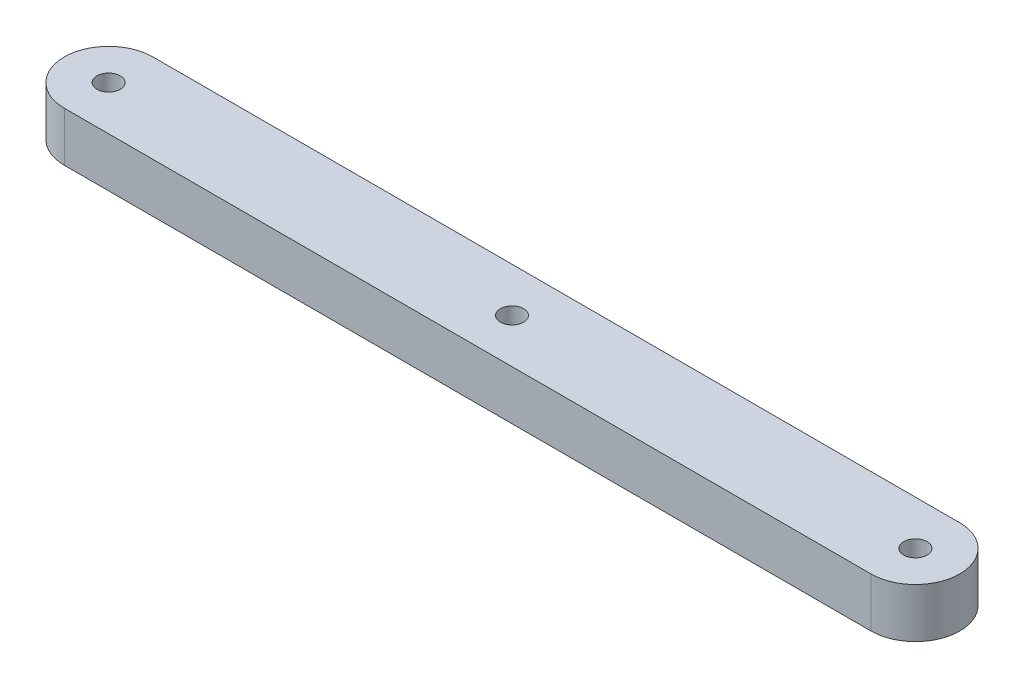
ISO-10303-21;
HEADER;
FILE_DESCRIPTION(('STEP AP214'),'2;1');
FILE_NAME('part.step','',(''),(''),'','','');
FILE_SCHEMA(('AUTOMOTIVE_DESIGN { 1 0 10303 214 1 1 1 1 }'));
ENDSEC;
DATA;
#1=APPLICATION_CONTEXT('core data for automotive mechanical design processes');
#2=APPLICATION_PROTOCOL_DEFINITION('international standard','automotive_design',2000,#1);
#3=PRODUCT_CONTEXT('',#1,'mechanical');
#4=PRODUCT('Part','Part','',(#3));
#5=PRODUCT_RELATED_PRODUCT_CATEGORY('part','',(#4));
#6=PRODUCT_DEFINITION_FORMATION('','',#4);
#7=PRODUCT_DEFINITION_CONTEXT('part definition',#1,'design');
#8=PRODUCT_DEFINITION('design','',#6,#7);
#9=PRODUCT_DEFINITION_SHAPE('','',#8);
#10=(LENGTH_UNIT() NAMED_UNIT(*) SI_UNIT(.MILLI.,.METRE.));
#11=(NAMED_UNIT(*) PLANE_ANGLE_UNIT() SI_UNIT($,.RADIAN.));
#12=(NAMED_UNIT(*) SI_UNIT($,.STERADIAN.) SOLID_ANGLE_UNIT());
#13=UNCERTAINTY_MEASURE_WITH_UNIT(LENGTH_MEASURE(1.E-05),#10,'distance_accuracy_value','');
#14=(GEOMETRIC_REPRESENTATION_CONTEXT(3) GLOBAL_UNCERTAINTY_ASSIGNED_CONTEXT((#13)) GLOBAL_UNIT_ASSIGNED_CONTEXT((#10,
#11,#12)) REPRESENTATION_CONTEXT('',''));
#15=CARTESIAN_POINT('',(0.,0.,0.));
#16=DIRECTION('',(0.,0.,1.));
#17=DIRECTION('',(1.,0.,0.));
#18=AXIS2_PLACEMENT_3D('',#15,#16,#17);
#19=CARTESIAN_POINT('',(0.,8.89,0.));
#20=DIRECTION('',(0.,1.,0.));
#21=DIRECTION('',(0.,0.,1.));
#22=AXIS2_PLACEMENT_3D('',#19,#20,#21);
#23=PLANE('',#22);
#24=CARTESIAN_POINT('',(72.52,8.89,0.));
#25=DIRECTION('',(0.,1.,0.));
#26=DIRECTION('',(0.,0.,1.));
#27=AXIS2_PLACEMENT_3D('',#24,#25,#26);
#28=CIRCLE('',#27,2.1);
#29=CARTESIAN_POINT('',(72.52,8.89,-2.1));
#30=VERTEX_POINT('',#29);
#31=EDGE_CURVE('E117',#30,#30,#28,.T.);
#32=ORIENTED_EDGE('',*,*,#31,.F.);
#33=EDGE_LOOP('',(#32));
#34=FACE_BOUND('',#33,.T.);
#35=CARTESIAN_POINT('',(0.,8.89,0.));
#36=DIRECTION('',(0.,1.,0.));
#37=DIRECTION('',(0.,0.,1.));
#38=AXIS2_PLACEMENT_3D('',#35,#36,#37);
#39=CIRCLE('',#38,7.97347609683682);
#40=CARTESIAN_POINT('',(0.,8.89,-7.97347609683682));
#41=VERTEX_POINT('',#40);
#42=CARTESIAN_POINT('',(0.,8.89,7.97347609683682));
#43=VERTEX_POINT('',#42);
#44=EDGE_CURVE('E87',#41,#43,#39,.T.);
#45=ORIENTED_EDGE('',*,*,#44,.T.);
#46=DIRECTION('',(1.,0.,0.));
#47=VECTOR('',#46,1.);
#48=CARTESIAN_POINT('',(0.,8.89,7.97347609683682));
#49=LINE('',#48,#47);
#50=CARTESIAN_POINT('',(145.04,8.89,7.97347609683682));
#51=VERTEX_POINT('',#50);
#52=EDGE_CURVE('E82',#43,#51,#49,.T.);
#53=ORIENTED_EDGE('',*,*,#52,.T.);
#54=CARTESIAN_POINT('',(145.04,8.89,0.));
#55=DIRECTION('',(0.,1.,0.));
#56=DIRECTION('',(0.,0.,1.));
#57=AXIS2_PLACEMENT_3D('',#54,#55,#56);
#58=CIRCLE('',#57,7.97347609683682);
#59=CARTESIAN_POINT('',(145.04,8.89,-7.97347609683682));
#60=VERTEX_POINT('',#59);
#61=EDGE_CURVE('E85',#51,#60,#58,.T.);
#62=ORIENTED_EDGE('',*,*,#61,.T.);
#63=DIRECTION('',(-1.,0.,0.));
#64=VECTOR('',#63,1.);
#65=CARTESIAN_POINT('',(0.,8.89,-7.97347609683682));
#66=LINE('',#65,#64);
#67=EDGE_CURVE('E52',#60,#41,#66,.T.);
#68=ORIENTED_EDGE('',*,*,#67,.T.);
#69=EDGE_LOOP('',(#45,#53,#62,#68));
#70=FACE_BOUND('',#69,.T.);
#71=CARTESIAN_POINT('',(145.04,8.89,0.));
#72=DIRECTION('',(0.,1.,0.));
#73=DIRECTION('',(0.,0.,1.));
#74=AXIS2_PLACEMENT_3D('',#71,#72,#73);
#75=CIRCLE('',#74,2.09999999999999);
#76=CARTESIAN_POINT('',(145.04,8.89,-2.09999999999999));
#77=VERTEX_POINT('',#76);
#78=EDGE_CURVE('E102',#77,#77,#75,.T.);
#79=ORIENTED_EDGE('',*,*,#78,.F.);
#80=EDGE_LOOP('',(#79));
#81=FACE_BOUND('',#80,.T.);
#82=CARTESIAN_POINT('',(0.,8.89,0.));
#83=DIRECTION('',(0.,1.,0.));
#84=DIRECTION('',(0.,0.,1.));
#85=AXIS2_PLACEMENT_3D('',#82,#83,#84);
#86=CIRCLE('',#85,2.1);
#87=CARTESIAN_POINT('',(0.,8.89,-2.1));
#88=VERTEX_POINT('',#87);
#89=EDGE_CURVE('E123',#88,#88,#86,.T.);
#90=ORIENTED_EDGE('',*,*,#89,.F.);
#91=EDGE_LOOP('',(#90));
#92=FACE_BOUND('',#91,.T.);
#93=ADVANCED_FACE('F35',(#34,#70,#81,#92),#23,.T.);
#94=CARTESIAN_POINT('',(0.,0.,0.));
#95=DIRECTION('',(0.,1.,0.));
#96=DIRECTION('',(0.,0.,1.));
#97=AXIS2_PLACEMENT_3D('',#94,#95,#96);
#98=PLANE('',#97);
#99=CARTESIAN_POINT('',(72.52,0.,0.));
#100=DIRECTION('',(0.,1.,0.));
#101=DIRECTION('',(0.,0.,1.));
#102=AXIS2_PLACEMENT_3D('',#99,#100,#101);
#103=CIRCLE('',#102,2.1);
#104=CARTESIAN_POINT('',(72.52,0.,-2.1));
#105=VERTEX_POINT('',#104);
#106=EDGE_CURVE('E120',#105,#105,#103,.T.);
#107=ORIENTED_EDGE('',*,*,#106,.T.);
#108=EDGE_LOOP('',(#107));
#109=FACE_BOUND('',#108,.T.);
#110=CARTESIAN_POINT('',(0.,0.,0.));
#111=DIRECTION('',(0.,1.,0.));
#112=DIRECTION('',(0.,0.,1.));
#113=AXIS2_PLACEMENT_3D('',#110,#111,#112);
#114=CIRCLE('',#113,7.97347609683682);
#115=CARTESIAN_POINT('',(0.,0.,-7.97347609683682));
#116=VERTEX_POINT('',#115);
#117=CARTESIAN_POINT('',(0.,0.,7.97347609683682));
#118=VERTEX_POINT('',#117);
#119=EDGE_CURVE('E99',#116,#118,#114,.T.);
#120=ORIENTED_EDGE('',*,*,#119,.F.);
#121=DIRECTION('',(-1.,0.,0.));
#122=VECTOR('',#121,1.);
#123=CARTESIAN_POINT('',(0.,0.,-7.97347609683682));
#124=LINE('',#123,#122);
#125=CARTESIAN_POINT('',(145.04,0.,-7.97347609683682));
#126=VERTEX_POINT('',#125);
#127=EDGE_CURVE('E75',#126,#116,#124,.T.);
#128=ORIENTED_EDGE('',*,*,#127,.F.);
#129=CARTESIAN_POINT('',(145.04,0.,0.));
#130=DIRECTION('',(0.,1.,0.));
#131=DIRECTION('',(0.,0.,1.));
#132=AXIS2_PLACEMENT_3D('',#129,#130,#131);
#133=CIRCLE('',#132,7.97347609683682);
#134=CARTESIAN_POINT('',(145.04,0.,7.97347609683682));
#135=VERTEX_POINT('',#134);
#136=EDGE_CURVE('E69',#135,#126,#133,.T.);
#137=ORIENTED_EDGE('',*,*,#136,.F.);
#138=DIRECTION('',(1.,0.,0.));
#139=VECTOR('',#138,1.);
#140=CARTESIAN_POINT('',(0.,0.,7.97347609683682));
#141=LINE('',#140,#139);
#142=EDGE_CURVE('E91',#118,#135,#141,.T.);
#143=ORIENTED_EDGE('',*,*,#142,.F.);
#144=EDGE_LOOP('',(#120,#128,#137,#143));
#145=FACE_BOUND('',#144,.T.);
#146=CARTESIAN_POINT('',(145.04,0.,0.));
#147=DIRECTION('',(0.,1.,0.));
#148=DIRECTION('',(0.,0.,1.));
#149=AXIS2_PLACEMENT_3D('',#146,#147,#148);
#150=CIRCLE('',#149,2.09999999999999);
#151=CARTESIAN_POINT('',(145.04,0.,-2.09999999999999));
#152=VERTEX_POINT('',#151);
#153=EDGE_CURVE('E114',#152,#152,#150,.T.);
#154=ORIENTED_EDGE('',*,*,#153,.T.);
#155=EDGE_LOOP('',(#154));
#156=FACE_BOUND('',#155,.T.);
#157=CARTESIAN_POINT('',(0.,0.,0.));
#158=DIRECTION('',(0.,1.,0.));
#159=DIRECTION('',(0.,0.,1.));
#160=AXIS2_PLACEMENT_3D('',#157,#158,#159);
#161=CIRCLE('',#160,2.1);
#162=CARTESIAN_POINT('',(0.,0.,-2.1));
#163=VERTEX_POINT('',#162);
#164=EDGE_CURVE('E126',#163,#163,#161,.T.);
#165=ORIENTED_EDGE('',*,*,#164,.T.);
#166=EDGE_LOOP('',(#165));
#167=FACE_BOUND('',#166,.T.);
#168=ADVANCED_FACE('F110',(#109,#145,#156,#167),#98,.F.);
#169=CARTESIAN_POINT('',(0.,8.89,0.));
#170=DIRECTION('',(0.,-1.,0.));
#171=DIRECTION('',(0.,0.,-1.));
#172=AXIS2_PLACEMENT_3D('',#169,#170,#171);
#173=CYLINDRICAL_SURFACE('',#172,7.97347609683682);
#174=ORIENTED_EDGE('',*,*,#119,.T.);
#175=DIRECTION('',(0.,-1.,0.));
#176=VECTOR('',#175,1.);
#177=CARTESIAN_POINT('',(0.,8.89,7.97347609683682));
#178=LINE('',#177,#176);
#179=EDGE_CURVE('E11',#43,#118,#178,.T.);
#180=ORIENTED_EDGE('',*,*,#179,.F.);
#181=ORIENTED_EDGE('',*,*,#44,.F.);
#182=DIRECTION('',(0.,-1.,0.));
#183=VECTOR('',#182,1.);
#184=CARTESIAN_POINT('',(0.,8.89,-7.97347609683682));
#185=LINE('',#184,#183);
#186=EDGE_CURVE('E95',#41,#116,#185,.T.);
#187=ORIENTED_EDGE('',*,*,#186,.T.);
#188=EDGE_LOOP('',(#174,#180,#181,#187));
#189=FACE_BOUND('',#188,.T.);
#190=ADVANCED_FACE('F37',(#189),#173,.T.);
#191=CARTESIAN_POINT('',(0.,8.89,7.97347609683682));
#192=DIRECTION('',(0.,0.,-1.));
#193=DIRECTION('',(-1.,0.,0.));
#194=AXIS2_PLACEMENT_3D('',#191,#192,#193);
#195=PLANE('',#194);
#196=ORIENTED_EDGE('',*,*,#142,.T.);
#197=DIRECTION('',(0.,-1.,0.));
#198=VECTOR('',#197,1.);
#199=CARTESIAN_POINT('',(145.04,8.89,7.97347609683682));
#200=LINE('',#199,#198);
#201=EDGE_CURVE('E44',#51,#135,#200,.T.);
#202=ORIENTED_EDGE('',*,*,#201,.F.);
#203=ORIENTED_EDGE('',*,*,#52,.F.);
#204=ORIENTED_EDGE('',*,*,#179,.T.);
#205=EDGE_LOOP('',(#196,#202,#203,#204));
#206=FACE_BOUND('',#205,.T.);
#207=ADVANCED_FACE('F90',(#206),#195,.F.);
#208=CARTESIAN_POINT('',(145.04,8.89,0.));
#209=DIRECTION('',(0.,-1.,0.));
#210=DIRECTION('',(0.,0.,-1.));
#211=AXIS2_PLACEMENT_3D('',#208,#209,#210);
#212=CYLINDRICAL_SURFACE('',#211,7.97347609683682);
#213=ORIENTED_EDGE('',*,*,#136,.T.);
#214=DIRECTION('',(0.,-1.,0.));
#215=VECTOR('',#214,1.);
#216=CARTESIAN_POINT('',(145.04,8.89,-7.97347609683682));
#217=LINE('',#216,#215);
#218=EDGE_CURVE('E92',#60,#126,#217,.T.);
#219=ORIENTED_EDGE('',*,*,#218,.F.);
#220=ORIENTED_EDGE('',*,*,#61,.F.);
#221=ORIENTED_EDGE('',*,*,#201,.T.);
#222=EDGE_LOOP('',(#213,#219,#220,#221));
#223=FACE_BOUND('',#222,.T.);
#224=ADVANCED_FACE('F93',(#223),#212,.T.);
#225=CARTESIAN_POINT('',(0.,8.89,-7.97347609683682));
#226=DIRECTION('',(0.,0.,1.));
#227=DIRECTION('',(1.,0.,0.));
#228=AXIS2_PLACEMENT_3D('',#225,#226,#227);
#229=PLANE('',#228);
#230=ORIENTED_EDGE('',*,*,#127,.T.);
#231=ORIENTED_EDGE('',*,*,#186,.F.);
#232=ORIENTED_EDGE('',*,*,#67,.F.);
#233=ORIENTED_EDGE('',*,*,#218,.T.);
#234=EDGE_LOOP('',(#230,#231,#232,#233));
#235=FACE_BOUND('',#234,.T.);
#236=ADVANCED_FACE('F107',(#235),#229,.F.);
#237=CARTESIAN_POINT('',(145.04,8.89,0.));
#238=DIRECTION('',(0.,-1.,0.));
#239=DIRECTION('',(0.,0.,-1.));
#240=AXIS2_PLACEMENT_3D('',#237,#238,#239);
#241=CYLINDRICAL_SURFACE('',#240,2.09999999999999);
#242=CARTESIAN_POINT('',(145.04,8.89,-2.09999999999999));
#243=CARTESIAN_POINT('',(145.04,8.79739583333333,-2.09999999999999));
#244=CARTESIAN_POINT('',(145.04,8.70479166666667,-2.09999999999999));
#245=CARTESIAN_POINT('',(145.04,8.51958333333333,-2.09999999999999));
#246=CARTESIAN_POINT('',(145.04,8.42697916666667,-2.09999999999999));
#247=CARTESIAN_POINT('',(145.04,8.24177083333333,-2.09999999999999));
#248=CARTESIAN_POINT('',(145.04,8.14916666666667,-2.09999999999999));
#249=CARTESIAN_POINT('',(145.04,7.96395833333333,-2.09999999999999));
#250=CARTESIAN_POINT('',(145.04,7.87135416666667,-2.09999999999999));
#251=CARTESIAN_POINT('',(145.04,7.68614583333333,-2.09999999999999));
#252=CARTESIAN_POINT('',(145.04,7.59354166666667,-2.09999999999999));
#253=CARTESIAN_POINT('',(145.04,7.40833333333333,-2.09999999999999));
#254=CARTESIAN_POINT('',(145.04,7.31572916666667,-2.09999999999999));
#255=CARTESIAN_POINT('',(145.04,7.13052083333333,-2.09999999999999));
#256=CARTESIAN_POINT('',(145.04,7.03791666666667,-2.09999999999999));
#257=CARTESIAN_POINT('',(145.04,6.85270833333333,-2.09999999999999));
#258=CARTESIAN_POINT('',(145.04,6.76010416666667,-2.09999999999999));
#259=CARTESIAN_POINT('',(145.04,6.57489583333333,-2.09999999999999));
#260=CARTESIAN_POINT('',(145.04,6.48229166666667,-2.09999999999999));
#261=CARTESIAN_POINT('',(145.04,6.29708333333333,-2.09999999999999));
#262=CARTESIAN_POINT('',(145.04,6.20447916666667,-2.09999999999999));
#263=CARTESIAN_POINT('',(145.04,6.01927083333333,-2.09999999999999));
#264=CARTESIAN_POINT('',(145.04,5.92666666666667,-2.09999999999999));
#265=CARTESIAN_POINT('',(145.04,5.74145833333333,-2.09999999999999));
#266=CARTESIAN_POINT('',(145.04,5.64885416666667,-2.09999999999999));
#267=CARTESIAN_POINT('',(145.04,5.46364583333333,-2.09999999999999));
#268=CARTESIAN_POINT('',(145.04,5.37104166666667,-2.09999999999999));
#269=CARTESIAN_POINT('',(145.04,5.18583333333333,-2.09999999999999));
#270=CARTESIAN_POINT('',(145.04,5.09322916666667,-2.09999999999999));
#271=CARTESIAN_POINT('',(145.04,4.90802083333333,-2.09999999999999));
#272=CARTESIAN_POINT('',(145.04,4.81541666666667,-2.09999999999999));
#273=CARTESIAN_POINT('',(145.04,4.63020833333333,-2.09999999999999));
#274=CARTESIAN_POINT('',(145.04,4.53760416666667,-2.09999999999999));
#275=CARTESIAN_POINT('',(145.04,4.35239583333333,-2.09999999999999));
#276=CARTESIAN_POINT('',(145.04,4.25979166666667,-2.09999999999999));
#277=CARTESIAN_POINT('',(145.04,4.07458333333333,-2.09999999999999));
#278=CARTESIAN_POINT('',(145.04,3.98197916666667,-2.09999999999999));
#279=CARTESIAN_POINT('',(145.04,3.79677083333333,-2.09999999999999));
#280=CARTESIAN_POINT('',(145.04,3.70416666666667,-2.09999999999999));
#281=CARTESIAN_POINT('',(145.04,3.51895833333333,-2.09999999999999));
#282=CARTESIAN_POINT('',(145.04,3.42635416666667,-2.09999999999999));
#283=CARTESIAN_POINT('',(145.04,3.24114583333333,-2.09999999999999));
#284=CARTESIAN_POINT('',(145.04,3.14854166666667,-2.09999999999999));
#285=CARTESIAN_POINT('',(145.04,2.96333333333333,-2.09999999999999));
#286=CARTESIAN_POINT('',(145.04,2.87072916666667,-2.09999999999999));
#287=CARTESIAN_POINT('',(145.04,2.68552083333333,-2.09999999999999));
#288=CARTESIAN_POINT('',(145.04,2.59291666666667,-2.09999999999999));
#289=CARTESIAN_POINT('',(145.04,2.40770833333333,-2.09999999999999));
#290=CARTESIAN_POINT('',(145.04,2.31510416666667,-2.09999999999999));
#291=CARTESIAN_POINT('',(145.04,2.12989583333333,-2.09999999999999));
#292=CARTESIAN_POINT('',(145.04,2.03729166666667,-2.09999999999999));
#293=CARTESIAN_POINT('',(145.04,1.85208333333333,-2.09999999999999));
#294=CARTESIAN_POINT('',(145.04,1.75947916666667,-2.09999999999999));
#295=CARTESIAN_POINT('',(145.04,1.57427083333333,-2.09999999999999));
#296=CARTESIAN_POINT('',(145.04,1.48166666666667,-2.09999999999999));
#297=CARTESIAN_POINT('',(145.04,1.29645833333333,-2.09999999999999));
#298=CARTESIAN_POINT('',(145.04,1.20385416666667,-2.09999999999999));
#299=CARTESIAN_POINT('',(145.04,1.01864583333333,-2.09999999999999));
#300=CARTESIAN_POINT('',(145.04,0.926041666666667,-2.09999999999999));
#301=CARTESIAN_POINT('',(145.04,0.740833333333334,-2.09999999999999));
#302=CARTESIAN_POINT('',(145.04,0.648229166666667,-2.09999999999999));
#303=CARTESIAN_POINT('',(145.04,0.463020833333334,-2.09999999999999));
#304=CARTESIAN_POINT('',(145.04,0.370416666666667,-2.09999999999999));
#305=CARTESIAN_POINT('',(145.04,0.185208333333334,-2.09999999999999));
#306=CARTESIAN_POINT('',(145.04,0.0926041666666669,-2.09999999999999));
#307=CARTESIAN_POINT('',(145.04,0.,-2.09999999999999));
#308=B_SPLINE_CURVE_WITH_KNOTS('',3,(#242,#243,#244,#245,#246,#247,#248,#249,#250,#251,#252,
#253,#254,#255,#256,#257,#258,#259,#260,#261,#262,#263,#264,#265,#266,#267,#268,#269,#270,#271,
#272,#273,#274,#275,#276,#277,#278,#279,#280,#281,#282,#283,#284,#285,#286,#287,#288,#289,#290,
#291,#292,#293,#294,#295,#296,#297,#298,#299,#300,#301,#302,#303,#304,#305,#306,#307),
.UNSPECIFIED.,.F.,.F.,(4,2,2,2,2,2,2,2,2,2,2,2,2,2,2,2,2,2,2,2,2,2,2,2,2,2,2,2,2,2,2,2,4),(0.,
0.2778125,0.555625000000001,0.833437500000001,1.11125,1.3890625,1.666875,1.9446875,2.2225,
2.5003125,2.778125,3.0559375,3.33375,3.6115625,3.889375,4.1671875,4.445,4.7228125,5.000625,
5.2784375,5.55625,5.8340625,6.111875,6.3896875,6.6675,6.9453125,7.223125,7.5009375,7.77875,
8.0565625,8.334375,8.6121875,8.89),.UNSPECIFIED.);
#309=EDGE_CURVE('BSEAM145',#77,#152,#308,.T.);
#310=ORIENTED_EDGE('',*,*,#78,.T.);
#311=ORIENTED_EDGE('',*,*,#153,.F.);
#312=ORIENTED_EDGE('',*,*,#309,.T.);
#313=ORIENTED_EDGE('',*,*,#309,.F.);
#314=EDGE_LOOP('',(#310,#312,#311,#313));
#315=FACE_BOUND('',#314,.T.);
#316=ADVANCED_FACE('F145',(#315),#241,.F.);
#317=CARTESIAN_POINT('',(72.52,8.89,0.));
#318=DIRECTION('',(0.,-1.,0.));
#319=DIRECTION('',(0.,0.,-1.));
#320=AXIS2_PLACEMENT_3D('',#317,#318,#319);
#321=CYLINDRICAL_SURFACE('',#320,2.1);
#322=CARTESIAN_POINT('',(72.52,8.89,-2.1));
#323=CARTESIAN_POINT('',(72.52,8.79739583333333,-2.1));
#324=CARTESIAN_POINT('',(72.52,8.70479166666667,-2.1));
#325=CARTESIAN_POINT('',(72.52,8.51958333333333,-2.1));
#326=CARTESIAN_POINT('',(72.52,8.42697916666667,-2.1));
#327=CARTESIAN_POINT('',(72.52,8.24177083333333,-2.1));
#328=CARTESIAN_POINT('',(72.52,8.14916666666667,-2.1));
#329=CARTESIAN_POINT('',(72.52,7.96395833333333,-2.1));
#330=CARTESIAN_POINT('',(72.52,7.87135416666667,-2.1));
#331=CARTESIAN_POINT('',(72.52,7.68614583333333,-2.1));
#332=CARTESIAN_POINT('',(72.52,7.59354166666667,-2.1));
#333=CARTESIAN_POINT('',(72.52,7.40833333333333,-2.1));
#334=CARTESIAN_POINT('',(72.52,7.31572916666667,-2.1));
#335=CARTESIAN_POINT('',(72.52,7.13052083333333,-2.1));
#336=CARTESIAN_POINT('',(72.52,7.03791666666667,-2.1));
#337=CARTESIAN_POINT('',(72.52,6.85270833333333,-2.1));
#338=CARTESIAN_POINT('',(72.52,6.76010416666667,-2.1));
#339=CARTESIAN_POINT('',(72.52,6.57489583333333,-2.1));
#340=CARTESIAN_POINT('',(72.52,6.48229166666667,-2.1));
#341=CARTESIAN_POINT('',(72.52,6.29708333333333,-2.1));
#342=CARTESIAN_POINT('',(72.52,6.20447916666667,-2.1));
#343=CARTESIAN_POINT('',(72.52,6.01927083333333,-2.1));
#344=CARTESIAN_POINT('',(72.52,5.92666666666667,-2.1));
#345=CARTESIAN_POINT('',(72.52,5.74145833333333,-2.1));
#346=CARTESIAN_POINT('',(72.52,5.64885416666667,-2.1));
#347=CARTESIAN_POINT('',(72.52,5.46364583333333,-2.1));
#348=CARTESIAN_POINT('',(72.52,5.37104166666667,-2.1));
#349=CARTESIAN_POINT('',(72.52,5.18583333333333,-2.1));
#350=CARTESIAN_POINT('',(72.52,5.09322916666667,-2.1));
#351=CARTESIAN_POINT('',(72.52,4.90802083333333,-2.1));
#352=CARTESIAN_POINT('',(72.52,4.81541666666667,-2.1));
#353=CARTESIAN_POINT('',(72.52,4.63020833333333,-2.1));
#354=CARTESIAN_POINT('',(72.52,4.53760416666667,-2.1));
#355=CARTESIAN_POINT('',(72.52,4.35239583333333,-2.1));
#356=CARTESIAN_POINT('',(72.52,4.25979166666667,-2.1));
#357=CARTESIAN_POINT('',(72.52,4.07458333333333,-2.1));
#358=CARTESIAN_POINT('',(72.52,3.98197916666667,-2.1));
#359=CARTESIAN_POINT('',(72.52,3.79677083333333,-2.1));
#360=CARTESIAN_POINT('',(72.52,3.70416666666667,-2.1));
#361=CARTESIAN_POINT('',(72.52,3.51895833333333,-2.1));
#362=CARTESIAN_POINT('',(72.52,3.42635416666667,-2.1));
#363=CARTESIAN_POINT('',(72.52,3.24114583333333,-2.1));
#364=CARTESIAN_POINT('',(72.52,3.14854166666667,-2.1));
#365=CARTESIAN_POINT('',(72.52,2.96333333333333,-2.1));
#366=CARTESIAN_POINT('',(72.52,2.87072916666667,-2.1));
#367=CARTESIAN_POINT('',(72.52,2.68552083333333,-2.1));
#368=CARTESIAN_POINT('',(72.52,2.59291666666667,-2.1));
#369=CARTESIAN_POINT('',(72.52,2.40770833333333,-2.1));
#370=CARTESIAN_POINT('',(72.52,2.31510416666667,-2.1));
#371=CARTESIAN_POINT('',(72.52,2.12989583333333,-2.1));
#372=CARTESIAN_POINT('',(72.52,2.03729166666667,-2.1));
#373=CARTESIAN_POINT('',(72.52,1.85208333333333,-2.1));
#374=CARTESIAN_POINT('',(72.52,1.75947916666667,-2.1));
#375=CARTESIAN_POINT('',(72.52,1.57427083333333,-2.1));
#376=CARTESIAN_POINT('',(72.52,1.48166666666667,-2.1));
#377=CARTESIAN_POINT('',(72.52,1.29645833333333,-2.1));
#378=CARTESIAN_POINT('',(72.52,1.20385416666667,-2.1));
#379=CARTESIAN_POINT('',(72.52,1.01864583333333,-2.1));
#380=CARTESIAN_POINT('',(72.52,0.926041666666667,-2.1));
#381=CARTESIAN_POINT('',(72.52,0.740833333333334,-2.1));
#382=CARTESIAN_POINT('',(72.52,0.648229166666667,-2.1));
#383=CARTESIAN_POINT('',(72.52,0.463020833333334,-2.1));
#384=CARTESIAN_POINT('',(72.52,0.370416666666667,-2.1));
#385=CARTESIAN_POINT('',(72.52,0.185208333333334,-2.1));
#386=CARTESIAN_POINT('',(72.52,0.0926041666666669,-2.1));
#387=CARTESIAN_POINT('',(72.52,0.,-2.1));
#388=B_SPLINE_CURVE_WITH_KNOTS('',3,(#322,#323,#324,#325,#326,#327,#328,#329,#330,#331,#332,
#333,#334,#335,#336,#337,#338,#339,#340,#341,#342,#343,#344,#345,#346,#347,#348,#349,#350,#351,
#352,#353,#354,#355,#356,#357,#358,#359,#360,#361,#362,#363,#364,#365,#366,#367,#368,#369,#370,
#371,#372,#373,#374,#375,#376,#377,#378,#379,#380,#381,#382,#383,#384,#385,#386,#387),
.UNSPECIFIED.,.F.,.F.,(4,2,2,2,2,2,2,2,2,2,2,2,2,2,2,2,2,2,2,2,2,2,2,2,2,2,2,2,2,2,2,2,4),(0.,
0.2778125,0.555625000000001,0.833437500000001,1.11125,1.3890625,1.666875,1.9446875,2.2225,
2.5003125,2.778125,3.0559375,3.33375,3.6115625,3.889375,4.1671875,4.445,4.7228125,5.000625,
5.2784375,5.55625,5.8340625,6.111875,6.3896875,6.6675,6.9453125,7.223125,7.5009375,7.77875,
8.0565625,8.334375,8.6121875,8.89),.UNSPECIFIED.);
#389=EDGE_CURVE('BSEAM191',#30,#105,#388,.T.);
#390=ORIENTED_EDGE('',*,*,#31,.T.);
#391=ORIENTED_EDGE('',*,*,#106,.F.);
#392=ORIENTED_EDGE('',*,*,#389,.T.);
#393=ORIENTED_EDGE('',*,*,#389,.F.);
#394=EDGE_LOOP('',(#390,#392,#391,#393));
#395=FACE_BOUND('',#394,.T.);
#396=ADVANCED_FACE('F191',(#395),#321,.F.);
#397=CARTESIAN_POINT('',(0.,8.89,0.));
#398=DIRECTION('',(0.,-1.,0.));
#399=DIRECTION('',(0.,0.,-1.));
#400=AXIS2_PLACEMENT_3D('',#397,#398,#399);
#401=CYLINDRICAL_SURFACE('',#400,2.1);
#402=CARTESIAN_POINT('',(0.,8.89,-2.1));
#403=CARTESIAN_POINT('',(0.,8.79739583333333,-2.1));
#404=CARTESIAN_POINT('',(0.,8.70479166666667,-2.1));
#405=CARTESIAN_POINT('',(0.,8.51958333333333,-2.1));
#406=CARTESIAN_POINT('',(0.,8.42697916666667,-2.1));
#407=CARTESIAN_POINT('',(0.,8.24177083333333,-2.1));
#408=CARTESIAN_POINT('',(0.,8.14916666666667,-2.1));
#409=CARTESIAN_POINT('',(0.,7.96395833333333,-2.1));
#410=CARTESIAN_POINT('',(0.,7.87135416666667,-2.1));
#411=CARTESIAN_POINT('',(0.,7.68614583333333,-2.1));
#412=CARTESIAN_POINT('',(0.,7.59354166666667,-2.1));
#413=CARTESIAN_POINT('',(0.,7.40833333333333,-2.1));
#414=CARTESIAN_POINT('',(0.,7.31572916666667,-2.1));
#415=CARTESIAN_POINT('',(0.,7.13052083333333,-2.1));
#416=CARTESIAN_POINT('',(0.,7.03791666666667,-2.1));
#417=CARTESIAN_POINT('',(0.,6.85270833333333,-2.1));
#418=CARTESIAN_POINT('',(0.,6.76010416666667,-2.1));
#419=CARTESIAN_POINT('',(0.,6.57489583333333,-2.1));
#420=CARTESIAN_POINT('',(0.,6.48229166666667,-2.1));
#421=CARTESIAN_POINT('',(0.,6.29708333333333,-2.1));
#422=CARTESIAN_POINT('',(0.,6.20447916666667,-2.1));
#423=CARTESIAN_POINT('',(0.,6.01927083333333,-2.1));
#424=CARTESIAN_POINT('',(0.,5.92666666666667,-2.1));
#425=CARTESIAN_POINT('',(0.,5.74145833333333,-2.1));
#426=CARTESIAN_POINT('',(0.,5.64885416666667,-2.1));
#427=CARTESIAN_POINT('',(0.,5.46364583333333,-2.1));
#428=CARTESIAN_POINT('',(0.,5.37104166666667,-2.1));
#429=CARTESIAN_POINT('',(0.,5.18583333333333,-2.1));
#430=CARTESIAN_POINT('',(0.,5.09322916666667,-2.1));
#431=CARTESIAN_POINT('',(0.,4.90802083333333,-2.1));
#432=CARTESIAN_POINT('',(0.,4.81541666666667,-2.1));
#433=CARTESIAN_POINT('',(0.,4.63020833333333,-2.1));
#434=CARTESIAN_POINT('',(0.,4.53760416666667,-2.1));
#435=CARTESIAN_POINT('',(0.,4.35239583333333,-2.1));
#436=CARTESIAN_POINT('',(0.,4.25979166666667,-2.1));
#437=CARTESIAN_POINT('',(0.,4.07458333333333,-2.1));
#438=CARTESIAN_POINT('',(0.,3.98197916666667,-2.1));
#439=CARTESIAN_POINT('',(0.,3.79677083333333,-2.1));
#440=CARTESIAN_POINT('',(0.,3.70416666666667,-2.1));
#441=CARTESIAN_POINT('',(0.,3.51895833333333,-2.1));
#442=CARTESIAN_POINT('',(0.,3.42635416666667,-2.1));
#443=CARTESIAN_POINT('',(0.,3.24114583333333,-2.1));
#444=CARTESIAN_POINT('',(0.,3.14854166666667,-2.1));
#445=CARTESIAN_POINT('',(0.,2.96333333333333,-2.1));
#446=CARTESIAN_POINT('',(0.,2.87072916666667,-2.1));
#447=CARTESIAN_POINT('',(0.,2.68552083333333,-2.1));
#448=CARTESIAN_POINT('',(0.,2.59291666666667,-2.1));
#449=CARTESIAN_POINT('',(0.,2.40770833333333,-2.1));
#450=CARTESIAN_POINT('',(0.,2.31510416666667,-2.1));
#451=CARTESIAN_POINT('',(0.,2.12989583333333,-2.1));
#452=CARTESIAN_POINT('',(0.,2.03729166666667,-2.1));
#453=CARTESIAN_POINT('',(0.,1.85208333333333,-2.1));
#454=CARTESIAN_POINT('',(0.,1.75947916666667,-2.1));
#455=CARTESIAN_POINT('',(0.,1.57427083333333,-2.1));
#456=CARTESIAN_POINT('',(0.,1.48166666666667,-2.1));
#457=CARTESIAN_POINT('',(0.,1.29645833333333,-2.1));
#458=CARTESIAN_POINT('',(0.,1.20385416666667,-2.1));
#459=CARTESIAN_POINT('',(0.,1.01864583333333,-2.1));
#460=CARTESIAN_POINT('',(0.,0.926041666666667,-2.1));
#461=CARTESIAN_POINT('',(0.,0.740833333333334,-2.1));
#462=CARTESIAN_POINT('',(0.,0.648229166666667,-2.1));
#463=CARTESIAN_POINT('',(0.,0.463020833333334,-2.1));
#464=CARTESIAN_POINT('',(0.,0.370416666666667,-2.1));
#465=CARTESIAN_POINT('',(0.,0.185208333333334,-2.1));
#466=CARTESIAN_POINT('',(0.,0.0926041666666669,-2.1));
#467=CARTESIAN_POINT('',(0.,0.,-2.1));
#468=B_SPLINE_CURVE_WITH_KNOTS('',3,(#402,#403,#404,#405,#406,#407,#408,#409,#410,#411,#412,
#413,#414,#415,#416,#417,#418,#419,#420,#421,#422,#423,#424,#425,#426,#427,#428,#429,#430,#431,
#432,#433,#434,#435,#436,#437,#438,#439,#440,#441,#442,#443,#444,#445,#446,#447,#448,#449,#450,
#451,#452,#453,#454,#455,#456,#457,#458,#459,#460,#461,#462,#463,#464,#465,#466,#467),
.UNSPECIFIED.,.F.,.F.,(4,2,2,2,2,2,2,2,2,2,2,2,2,2,2,2,2,2,2,2,2,2,2,2,2,2,2,2,2,2,2,2,4),(0.,
0.2778125,0.555625000000001,0.833437500000001,1.11125,1.3890625,1.666875,1.9446875,2.2225,
2.5003125,2.778125,3.0559375,3.33375,3.6115625,3.889375,4.1671875,4.445,4.7228125,5.000625,
5.2784375,5.55625,5.8340625,6.111875,6.3896875,6.6675,6.9453125,7.223125,7.5009375,7.77875,
8.0565625,8.334375,8.6121875,8.89),.UNSPECIFIED.);
#469=EDGE_CURVE('BSEAM132',#88,#163,#468,.T.);
#470=ORIENTED_EDGE('',*,*,#89,.T.);
#471=ORIENTED_EDGE('',*,*,#164,.F.);
#472=ORIENTED_EDGE('',*,*,#469,.T.);
#473=ORIENTED_EDGE('',*,*,#469,.F.);
#474=EDGE_LOOP('',(#470,#472,#471,#473));
#475=FACE_BOUND('',#474,.T.);
#476=ADVANCED_FACE('F132',(#475),#401,.F.);
#477=CLOSED_SHELL('',(#93,#168,#190,#207,#224,#236,#316,#396,#476));
#478=MANIFOLD_SOLID_BREP('B2',#477);
#479=ADVANCED_BREP_SHAPE_REPRESENTATION('',(#18,#478),#14);
#480=SHAPE_DEFINITION_REPRESENTATION(#9,#479);
ENDSEC;
END-ISO-10303-21;
